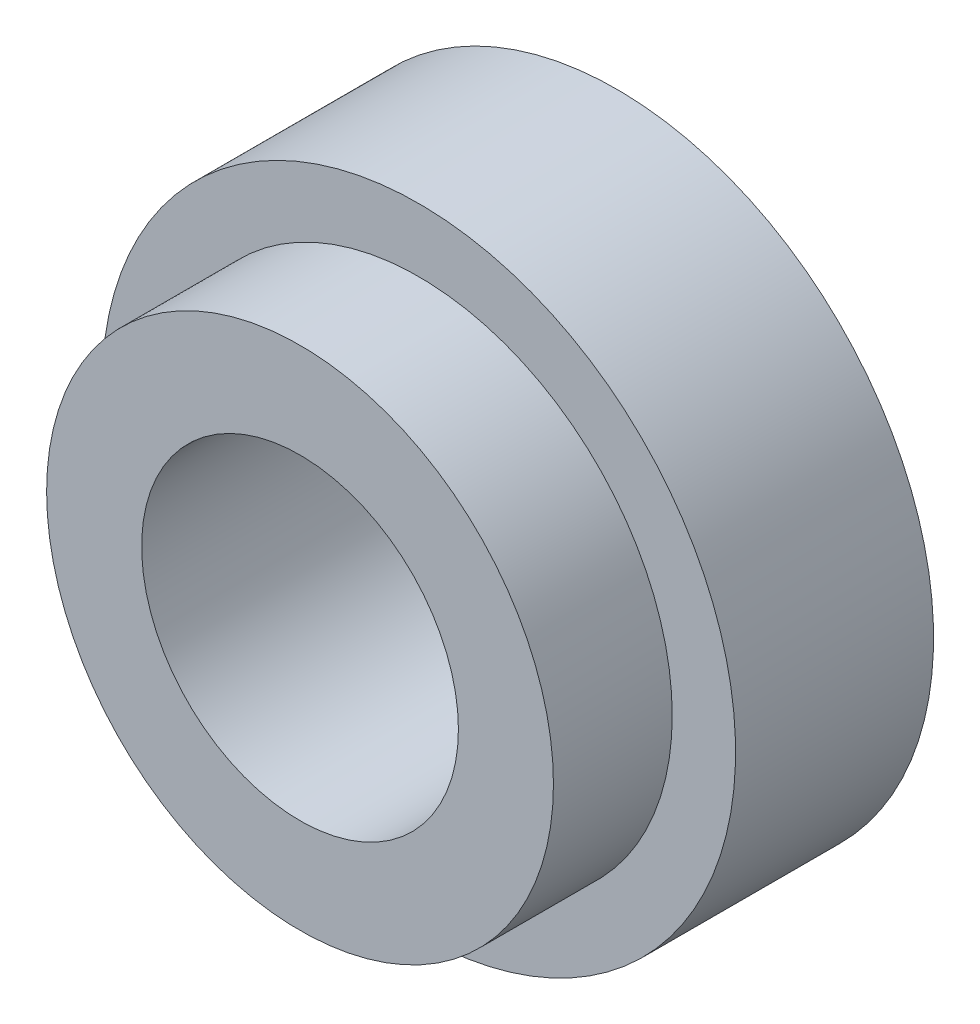
ISO-10303-21;
HEADER;
FILE_DESCRIPTION(('STEP AP214'),'2;1');
FILE_NAME('part.step','',(''),(''),'','','');
FILE_SCHEMA(('AUTOMOTIVE_DESIGN { 1 0 10303 214 1 1 1 1 }'));
ENDSEC;
DATA;
#1=APPLICATION_CONTEXT('core data for automotive mechanical design processes');
#2=APPLICATION_PROTOCOL_DEFINITION('international standard','automotive_design',2000,#1);
#3=PRODUCT_CONTEXT('',#1,'mechanical');
#4=PRODUCT('Part','Part','',(#3));
#5=PRODUCT_RELATED_PRODUCT_CATEGORY('part','',(#4));
#6=PRODUCT_DEFINITION_FORMATION('','',#4);
#7=PRODUCT_DEFINITION_CONTEXT('part definition',#1,'design');
#8=PRODUCT_DEFINITION('design','',#6,#7);
#9=PRODUCT_DEFINITION_SHAPE('','',#8);
#10=(LENGTH_UNIT() NAMED_UNIT(*) SI_UNIT(.MILLI.,.METRE.));
#11=(NAMED_UNIT(*) PLANE_ANGLE_UNIT() SI_UNIT($,.RADIAN.));
#12=(NAMED_UNIT(*) SI_UNIT($,.STERADIAN.) SOLID_ANGLE_UNIT());
#13=UNCERTAINTY_MEASURE_WITH_UNIT(LENGTH_MEASURE(1.E-05),#10,'distance_accuracy_value','');
#14=(GEOMETRIC_REPRESENTATION_CONTEXT(3) GLOBAL_UNCERTAINTY_ASSIGNED_CONTEXT((#13)) GLOBAL_UNIT_ASSIGNED_CONTEXT((#10,
#11,#12)) REPRESENTATION_CONTEXT('',''));
#15=CARTESIAN_POINT('',(0.,0.,0.));
#16=DIRECTION('',(0.,0.,1.));
#17=DIRECTION('',(1.,0.,0.));
#18=AXIS2_PLACEMENT_3D('',#15,#16,#17);
#19=CARTESIAN_POINT('',(0.,-22.,0.));
#20=DIRECTION('',(0.,0.,1.));
#21=DIRECTION('',(1.,0.,0.));
#22=AXIS2_PLACEMENT_3D('',#19,#20,#21);
#23=PLANE('',#22);
#24=CARTESIAN_POINT('',(0.,-22.,0.));
#25=DIRECTION('',(0.,0.,1.));
#26=DIRECTION('',(1.,0.,0.));
#27=AXIS2_PLACEMENT_3D('',#24,#25,#26);
#28=CIRCLE('',#27,4.);
#29=CARTESIAN_POINT('',(4.,-22.,0.));
#30=VERTEX_POINT('',#29);
#31=EDGE_CURVE('E50',#30,#30,#28,.T.);
#32=ORIENTED_EDGE('',*,*,#31,.F.);
#33=EDGE_LOOP('',(#32));
#34=FACE_BOUND('',#33,.T.);
#35=CARTESIAN_POINT('',(0.,-22.,0.));
#36=DIRECTION('',(0.,0.,1.));
#37=DIRECTION('',(1.,0.,0.));
#38=AXIS2_PLACEMENT_3D('',#35,#36,#37);
#39=CIRCLE('',#38,6.4);
#40=CARTESIAN_POINT('',(6.4,-22.,0.));
#41=VERTEX_POINT('',#40);
#42=EDGE_CURVE('E10',#41,#41,#39,.T.);
#43=ORIENTED_EDGE('',*,*,#42,.T.);
#44=EDGE_LOOP('',(#43));
#45=FACE_BOUND('',#44,.T.);
#46=ADVANCED_FACE('F27',(#34,#45),#23,.T.);
#47=CARTESIAN_POINT('',(0.,-22.,-21.1019335983756));
#48=DIRECTION('',(0.,0.,1.));
#49=DIRECTION('',(1.,0.,0.));
#50=AXIS2_PLACEMENT_3D('',#47,#48,#49);
#51=CYLINDRICAL_SURFACE('',#50,6.4);
#52=ORIENTED_EDGE('',*,*,#42,.F.);
#53=EDGE_LOOP('',(#52));
#54=FACE_BOUND('',#53,.T.);
#55=CARTESIAN_POINT('',(0.,-22.,-3.));
#56=DIRECTION('',(0.,0.,-1.));
#57=DIRECTION('',(-1.,0.,0.));
#58=AXIS2_PLACEMENT_3D('',#55,#56,#57);
#59=CIRCLE('',#58,6.4);
#60=CARTESIAN_POINT('',(-6.4,-22.,-3.));
#61=VERTEX_POINT('',#60);
#62=EDGE_CURVE('E34',#61,#61,#59,.F.);
#63=ORIENTED_EDGE('',*,*,#62,.T.);
#64=EDGE_LOOP('',(#63));
#65=FACE_BOUND('',#64,.T.);
#66=ADVANCED_FACE('F29',(#54,#65),#51,.T.);
#67=CARTESIAN_POINT('',(0.,-22.,-8.));
#68=DIRECTION('',(0.,0.,1.));
#69=DIRECTION('',(1.,0.,0.));
#70=AXIS2_PLACEMENT_3D('',#67,#68,#69);
#71=CYLINDRICAL_SURFACE('',#70,8.);
#72=CARTESIAN_POINT('',(0.,-22.,-8.));
#73=DIRECTION('',(0.,0.,-1.));
#74=DIRECTION('',(-1.,0.,0.));
#75=AXIS2_PLACEMENT_3D('',#72,#73,#74);
#76=CIRCLE('',#75,8.);
#77=CARTESIAN_POINT('',(-8.,-22.,-8.));
#78=VERTEX_POINT('',#77);
#79=EDGE_CURVE('E38',#78,#78,#76,.T.);
#80=ORIENTED_EDGE('',*,*,#79,.F.);
#81=EDGE_LOOP('',(#80));
#82=FACE_BOUND('',#81,.T.);
#83=CARTESIAN_POINT('',(0.,-22.,-3.));
#84=DIRECTION('',(0.,0.,-1.));
#85=DIRECTION('',(-1.,0.,0.));
#86=AXIS2_PLACEMENT_3D('',#83,#84,#85);
#87=CIRCLE('',#86,8.);
#88=CARTESIAN_POINT('',(-8.,-22.,-3.));
#89=VERTEX_POINT('',#88);
#90=EDGE_CURVE('E42',#89,#89,#87,.T.);
#91=ORIENTED_EDGE('',*,*,#90,.T.);
#92=EDGE_LOOP('',(#91));
#93=FACE_BOUND('',#92,.T.);
#94=ADVANCED_FACE('F62',(#82,#93),#71,.T.);
#95=CARTESIAN_POINT('',(0.,-22.,-8.));
#96=DIRECTION('',(0.,0.,-1.));
#97=DIRECTION('',(-1.,0.,0.));
#98=AXIS2_PLACEMENT_3D('',#95,#96,#97);
#99=PLANE('',#98);
#100=CARTESIAN_POINT('',(0.,-22.,-8.));
#101=DIRECTION('',(0.,0.,1.));
#102=DIRECTION('',(1.,0.,0.));
#103=AXIS2_PLACEMENT_3D('',#100,#101,#102);
#104=CIRCLE('',#103,4.);
#105=CARTESIAN_POINT('',(4.,-22.,-8.));
#106=VERTEX_POINT('',#105);
#107=EDGE_CURVE('E47',#106,#106,#104,.T.);
#108=ORIENTED_EDGE('',*,*,#107,.T.);
#109=EDGE_LOOP('',(#108));
#110=FACE_BOUND('',#109,.T.);
#111=ORIENTED_EDGE('',*,*,#79,.T.);
#112=EDGE_LOOP('',(#111));
#113=FACE_BOUND('',#112,.T.);
#114=ADVANCED_FACE('F67',(#110,#113),#99,.T.);
#115=CARTESIAN_POINT('',(0.,-22.,-3.));
#116=DIRECTION('',(0.,0.,-1.));
#117=DIRECTION('',(-1.,0.,0.));
#118=AXIS2_PLACEMENT_3D('',#115,#116,#117);
#119=PLANE('',#118);
#120=ORIENTED_EDGE('',*,*,#62,.F.);
#121=EDGE_LOOP('',(#120));
#122=FACE_BOUND('',#121,.T.);
#123=ORIENTED_EDGE('',*,*,#90,.F.);
#124=EDGE_LOOP('',(#123));
#125=FACE_BOUND('',#124,.T.);
#126=ADVANCED_FACE('F70',(#122,#125),#119,.F.);
#127=CARTESIAN_POINT('',(0.,-22.,-8.));
#128=DIRECTION('',(0.,0.,1.));
#129=DIRECTION('',(1.,0.,0.));
#130=AXIS2_PLACEMENT_3D('',#127,#128,#129);
#131=CYLINDRICAL_SURFACE('',#130,4.);
#132=ORIENTED_EDGE('',*,*,#107,.F.);
#133=EDGE_LOOP('',(#132));
#134=FACE_BOUND('',#133,.T.);
#135=ORIENTED_EDGE('',*,*,#31,.T.);
#136=EDGE_LOOP('',(#135));
#137=FACE_BOUND('',#136,.T.);
#138=ADVANCED_FACE('F54',(#134,#137),#131,.F.);
#139=CLOSED_SHELL('',(#46,#66,#94,#114,#126,#138));
#140=MANIFOLD_SOLID_BREP('B2',#139);
#141=ADVANCED_BREP_SHAPE_REPRESENTATION('',(#18,#140),#14);
#142=SHAPE_DEFINITION_REPRESENTATION(#9,#141);
ENDSEC;
END-ISO-10303-21;
